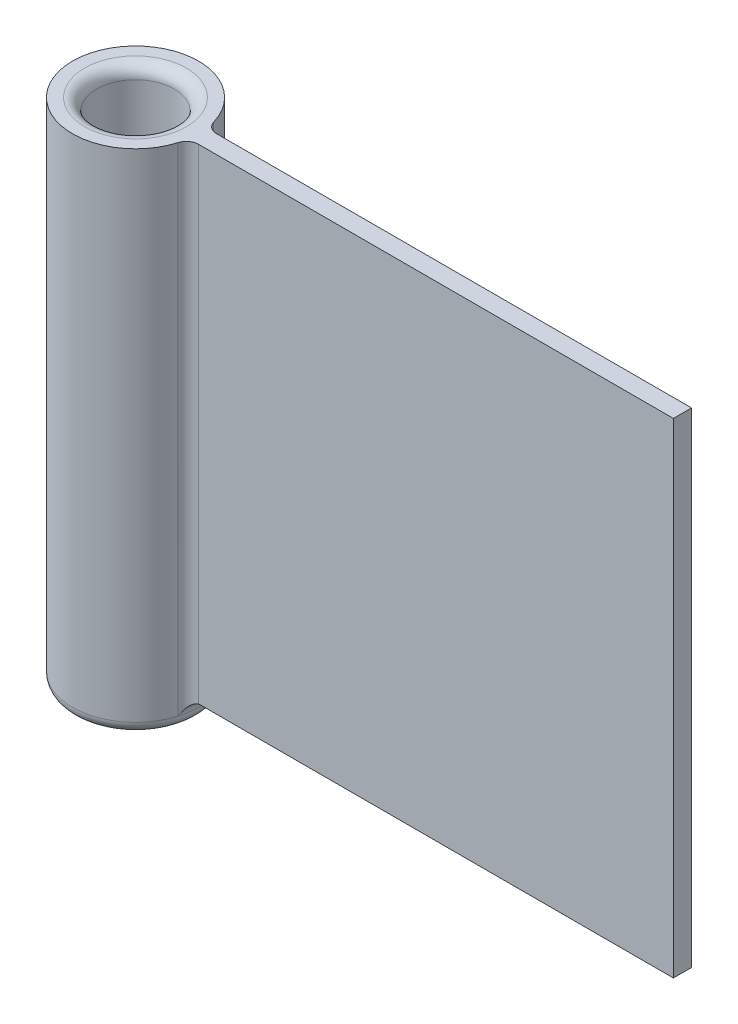
ISO-10303-21;
HEADER;
FILE_DESCRIPTION(('STEP AP214'),'2;1');
FILE_NAME('part.step','',(''),(''),'','','');
FILE_SCHEMA(('AUTOMOTIVE_DESIGN { 1 0 10303 214 1 1 1 1 }'));
ENDSEC;
DATA;
#1=APPLICATION_CONTEXT('core data for automotive mechanical design processes');
#2=APPLICATION_PROTOCOL_DEFINITION('international standard','automotive_design',2000,#1);
#3=PRODUCT_CONTEXT('',#1,'mechanical');
#4=PRODUCT('Part','Part','',(#3));
#5=PRODUCT_RELATED_PRODUCT_CATEGORY('part','',(#4));
#6=PRODUCT_DEFINITION_FORMATION('','',#4);
#7=PRODUCT_DEFINITION_CONTEXT('part definition',#1,'design');
#8=PRODUCT_DEFINITION('design','',#6,#7);
#9=PRODUCT_DEFINITION_SHAPE('','',#8);
#10=(LENGTH_UNIT() NAMED_UNIT(*) SI_UNIT(.MILLI.,.METRE.));
#11=(NAMED_UNIT(*) PLANE_ANGLE_UNIT() SI_UNIT($,.RADIAN.));
#12=(NAMED_UNIT(*) SI_UNIT($,.STERADIAN.) SOLID_ANGLE_UNIT());
#13=UNCERTAINTY_MEASURE_WITH_UNIT(LENGTH_MEASURE(1.E-05),#10,'distance_accuracy_value','');
#14=(GEOMETRIC_REPRESENTATION_CONTEXT(3) GLOBAL_UNCERTAINTY_ASSIGNED_CONTEXT((#13)) GLOBAL_UNIT_ASSIGNED_CONTEXT((#10,
#11,#12)) REPRESENTATION_CONTEXT('',''));
#15=CARTESIAN_POINT('',(0.,0.,0.));
#16=DIRECTION('',(0.,0.,1.));
#17=DIRECTION('',(1.,0.,0.));
#18=AXIS2_PLACEMENT_3D('',#15,#16,#17);
#19=CARTESIAN_POINT('',(0.,0.,0.));
#20=DIRECTION('',(0.,1.,0.));
#21=DIRECTION('',(0.,0.,1.));
#22=AXIS2_PLACEMENT_3D('',#19,#20,#21);
#23=PLANE('',#22);
#24=DIRECTION('',(1.,0.,0.));
#25=VECTOR('',#24,1.);
#26=CARTESIAN_POINT('',(45.1456292132255,0.,0.75));
#27=LINE('',#26,#25);
#28=CARTESIAN_POINT('',(6.15446992030996,0.,0.749999999999995));
#29=VERTEX_POINT('',#28);
#30=CARTESIAN_POINT('',(45.1456292132255,0.,0.75));
#31=VERTEX_POINT('',#30);
#32=EDGE_CURVE('E123',#29,#31,#27,.T.);
#33=ORIENTED_EDGE('',*,*,#32,.F.);
#34=CARTESIAN_POINT('',(0.,0.,0.));
#35=DIRECTION('',(0.,1.,0.));
#36=DIRECTION('',(0.,0.,1.));
#37=AXIS2_PLACEMENT_3D('',#34,#35,#36);
#38=CIRCLE('',#37,6.2);
#39=CARTESIAN_POINT('',(6.15446992030996,0.,-0.749999999999995));
#40=VERTEX_POINT('',#39);
#41=EDGE_CURVE('E180',#29,#40,#38,.T.);
#42=ORIENTED_EDGE('',*,*,#41,.T.);
#43=DIRECTION('',(-1.,0.,0.));
#44=VECTOR('',#43,1.);
#45=CARTESIAN_POINT('',(45.1456292132255,0.,-0.75));
#46=LINE('',#45,#44);
#47=CARTESIAN_POINT('',(45.1456292132255,0.,-0.75));
#48=VERTEX_POINT('',#47);
#49=EDGE_CURVE('E271',#48,#40,#46,.T.);
#50=ORIENTED_EDGE('',*,*,#49,.F.);
#51=DIRECTION('',(0.,0.,-1.));
#52=VECTOR('',#51,1.);
#53=CARTESIAN_POINT('',(45.1456292132255,0.,0.75));
#54=LINE('',#53,#52);
#55=EDGE_CURVE('E127',#31,#48,#54,.T.);
#56=ORIENTED_EDGE('',*,*,#55,.F.);
#57=EDGE_LOOP('',(#33,#42,#50,#56));
#58=FACE_BOUND('',#57,.T.);
#59=ADVANCED_FACE('F39',(#58),#23,.F.);
#60=CARTESIAN_POINT('',(0.,40.,0.));
#61=DIRECTION('',(0.,-1.,0.));
#62=DIRECTION('',(0.,0.,-1.));
#63=AXIS2_PLACEMENT_3D('',#60,#61,#62);
#64=CYLINDRICAL_SURFACE('',#63,5.2);
#65=CARTESIAN_POINT('',(0.,-1.,0.));
#66=DIRECTION('',(0.,-1.,0.));
#67=DIRECTION('',(0.,0.,-1.));
#68=AXIS2_PLACEMENT_3D('',#65,#66,#67);
#69=CIRCLE('',#68,5.2);
#70=CARTESIAN_POINT('',(4.98856027434991,-1.,-1.46774193548387));
#71=VERTEX_POINT('',#70);
#72=CARTESIAN_POINT('',(4.98856027434991,-1.,1.46774193548387));
#73=VERTEX_POINT('',#72);
#74=EDGE_CURVE('E160',#71,#73,#69,.F.);
#75=ORIENTED_EDGE('',*,*,#74,.T.);
#76=DIRECTION('',(0.,-1.,0.));
#77=VECTOR('',#76,1.);
#78=CARTESIAN_POINT('',(4.98856027434991,40.,1.46774193548387));
#79=LINE('',#78,#77);
#80=CARTESIAN_POINT('',(4.98856027434991,40.,1.46774193548387));
#81=VERTEX_POINT('',#80);
#82=EDGE_CURVE('E165',#73,#81,#79,.F.);
#83=ORIENTED_EDGE('',*,*,#82,.T.);
#84=CARTESIAN_POINT('',(0.,40.,0.));
#85=DIRECTION('',(0.,1.,0.));
#86=DIRECTION('',(0.,0.,1.));
#87=AXIS2_PLACEMENT_3D('',#84,#85,#86);
#88=CIRCLE('',#87,5.2);
#89=CARTESIAN_POINT('',(4.98856027434991,40.,-1.46774193548387));
#90=VERTEX_POINT('',#89);
#91=EDGE_CURVE('E129',#90,#81,#88,.T.);
#92=ORIENTED_EDGE('',*,*,#91,.F.);
#93=DIRECTION('',(0.,-1.,0.));
#94=VECTOR('',#93,1.);
#95=CARTESIAN_POINT('',(4.98856027434991,40.,-1.46774193548387));
#96=LINE('',#95,#94);
#97=EDGE_CURVE('E157',#90,#71,#96,.T.);
#98=ORIENTED_EDGE('',*,*,#97,.T.);
#99=EDGE_LOOP('',(#75,#83,#92,#98));
#100=FACE_BOUND('',#99,.T.);
#101=ADVANCED_FACE('F216',(#100),#64,.T.);
#102=CARTESIAN_POINT('',(0.,40.,0.));
#103=DIRECTION('',(0.,1.,0.));
#104=DIRECTION('',(0.,0.,1.));
#105=AXIS2_PLACEMENT_3D('',#102,#103,#104);
#106=PLANE('',#105);
#107=CARTESIAN_POINT('',(0.,40.,0.));
#108=DIRECTION('',(0.,1.,0.));
#109=DIRECTION('',(0.,0.,1.));
#110=AXIS2_PLACEMENT_3D('',#107,#108,#109);
#111=CIRCLE('',#110,4.2);
#112=CARTESIAN_POINT('',(0.,40.,4.2));
#113=VERTEX_POINT('',#112);
#114=EDGE_CURVE('E151',#113,#113,#111,.F.);
#115=ORIENTED_EDGE('',*,*,#114,.T.);
#116=EDGE_LOOP('',(#115));
#117=FACE_BOUND('',#116,.T.);
#118=DIRECTION('',(-1.,0.,0.));
#119=VECTOR('',#118,1.);
#120=CARTESIAN_POINT('',(45.1456292132255,40.,-0.75));
#121=LINE('',#120,#119);
#122=CARTESIAN_POINT('',(45.1456292132255,40.,-0.75));
#123=VERTEX_POINT('',#122);
#124=CARTESIAN_POINT('',(5.94789878864797,40.,-0.749999999999995));
#125=VERTEX_POINT('',#124);
#126=EDGE_CURVE('E105',#123,#125,#121,.T.);
#127=ORIENTED_EDGE('',*,*,#126,.T.);
#128=CARTESIAN_POINT('',(5.94789878864797,40.,-1.75));
#129=DIRECTION('',(0.,1.,0.));
#130=DIRECTION('',(0.,0.,1.));
#131=AXIS2_PLACEMENT_3D('',#128,#129,#130);
#132=CIRCLE('',#131,1.);
#133=EDGE_CURVE('E177',#125,#90,#132,.F.);
#134=ORIENTED_EDGE('',*,*,#133,.T.);
#135=ORIENTED_EDGE('',*,*,#91,.T.);
#136=CARTESIAN_POINT('',(5.94789878864797,40.,1.75));
#137=DIRECTION('',(0.,1.,0.));
#138=DIRECTION('',(0.,0.,1.));
#139=AXIS2_PLACEMENT_3D('',#136,#137,#138);
#140=CIRCLE('',#139,1.);
#141=CARTESIAN_POINT('',(5.94789878864797,40.,0.749999999999995));
#142=VERTEX_POINT('',#141);
#143=EDGE_CURVE('E174',#81,#142,#140,.F.);
#144=ORIENTED_EDGE('',*,*,#143,.T.);
#145=DIRECTION('',(1.,0.,0.));
#146=VECTOR('',#145,1.);
#147=CARTESIAN_POINT('',(45.1456292132255,40.,0.75));
#148=LINE('',#147,#146);
#149=CARTESIAN_POINT('',(45.1456292132255,40.,0.75));
#150=VERTEX_POINT('',#149);
#151=EDGE_CURVE('E114',#142,#150,#148,.T.);
#152=ORIENTED_EDGE('',*,*,#151,.T.);
#153=DIRECTION('',(0.,0.,-1.));
#154=VECTOR('',#153,1.);
#155=CARTESIAN_POINT('',(45.1456292132255,40.,0.75));
#156=LINE('',#155,#154);
#157=EDGE_CURVE('E115',#150,#123,#156,.T.);
#158=ORIENTED_EDGE('',*,*,#157,.T.);
#159=EDGE_LOOP('',(#127,#134,#135,#144,#152,#158));
#160=FACE_BOUND('',#159,.T.);
#161=ADVANCED_FACE('F118',(#117,#160),#106,.T.);
#162=CARTESIAN_POINT('',(0.,40.,0.));
#163=DIRECTION('',(0.,-1.,0.));
#164=DIRECTION('',(0.,0.,-1.));
#165=AXIS2_PLACEMENT_3D('',#162,#163,#164);
#166=CYLINDRICAL_SURFACE('',#165,3.2);
#167=CARTESIAN_POINT('',(0.,1.,0.));
#168=DIRECTION('',(0.,-1.,0.));
#169=DIRECTION('',(0.,0.,-1.));
#170=AXIS2_PLACEMENT_3D('',#167,#168,#169);
#171=CIRCLE('',#170,3.2);
#172=CARTESIAN_POINT('',(0.,1.,-3.2));
#173=VERTEX_POINT('',#172);
#174=EDGE_CURVE('E147',#173,#173,#171,.T.);
#175=ORIENTED_EDGE('',*,*,#174,.T.);
#176=EDGE_LOOP('',(#175));
#177=FACE_BOUND('',#176,.T.);
#178=CARTESIAN_POINT('',(0.,39.,0.));
#179=DIRECTION('',(0.,1.,0.));
#180=DIRECTION('',(0.,0.,1.));
#181=AXIS2_PLACEMENT_3D('',#178,#179,#180);
#182=CIRCLE('',#181,3.2);
#183=CARTESIAN_POINT('',(0.,39.,3.2));
#184=VERTEX_POINT('',#183);
#185=EDGE_CURVE('E143',#184,#184,#182,.T.);
#186=ORIENTED_EDGE('',*,*,#185,.T.);
#187=EDGE_LOOP('',(#186));
#188=FACE_BOUND('',#187,.T.);
#189=ADVANCED_FACE('F243',(#177,#188),#166,.F.);
#190=CARTESIAN_POINT('',(45.1456292132255,40.,0.75));
#191=DIRECTION('',(-1.,0.,0.));
#192=DIRECTION('',(0.,0.,1.));
#193=AXIS2_PLACEMENT_3D('',#190,#191,#192);
#194=PLANE('',#193);
#195=ORIENTED_EDGE('',*,*,#55,.T.);
#196=DIRECTION('',(0.,-1.,0.));
#197=VECTOR('',#196,1.);
#198=CARTESIAN_POINT('',(45.1456292132255,40.,-0.75));
#199=LINE('',#198,#197);
#200=EDGE_CURVE('E110',#123,#48,#199,.T.);
#201=ORIENTED_EDGE('',*,*,#200,.F.);
#202=ORIENTED_EDGE('',*,*,#157,.F.);
#203=DIRECTION('',(0.,-1.,0.));
#204=VECTOR('',#203,1.);
#205=CARTESIAN_POINT('',(45.1456292132255,40.,0.75));
#206=LINE('',#205,#204);
#207=EDGE_CURVE('E130',#150,#31,#206,.T.);
#208=ORIENTED_EDGE('',*,*,#207,.T.);
#209=EDGE_LOOP('',(#195,#201,#202,#208));
#210=FACE_BOUND('',#209,.T.);
#211=ADVANCED_FACE('F125',(#210),#194,.F.);
#212=CARTESIAN_POINT('',(45.1456292132255,40.,-0.75));
#213=DIRECTION('',(0.,0.,1.));
#214=DIRECTION('',(1.,0.,0.));
#215=AXIS2_PLACEMENT_3D('',#212,#213,#214);
#216=PLANE('',#215);
#217=ORIENTED_EDGE('',*,*,#49,.T.);
#218=CARTESIAN_POINT('',(6.15446992030995,0.,-0.749999999999995));
#219=CARTESIAN_POINT('',(6.11967844426265,-9.78500983339099E-06,-0.749999999999995));
#220=CARTESIAN_POINT('',(6.08506843363106,-0.00178455189712006,-0.749999999999995));
#221=CARTESIAN_POINT('',(6.01621139023961,-0.00886404459018018,-0.749999999999995));
#222=CARTESIAN_POINT('',(5.98196435698388,-0.0141687655729066,-0.749999999999995));
#223=CARTESIAN_POINT('',(5.94789878864797,-0.0212384636100392,-0.749999999999995));
#224=B_SPLINE_CURVE_WITH_KNOTS('',3,(#218,#219,#220,#221,#222,#223),.UNSPECIFIED.,.F.,.F.,(4,2,
4),(0.,0.103966454689998,0.207932767328836),.UNSPECIFIED.);
#225=CARTESIAN_POINT('',(5.94789878864797,-0.0212384636100391,-0.749999999999995));
#226=VERTEX_POINT('',#225);
#227=EDGE_CURVE('E53',#40,#226,#224,.T.);
#228=ORIENTED_EDGE('',*,*,#227,.T.);
#229=DIRECTION('',(0.,1.,0.));
#230=VECTOR('',#229,1.);
#231=CARTESIAN_POINT('',(5.94789878864797,40.,-0.749999999999995));
#232=LINE('',#231,#230);
#233=EDGE_CURVE('E59',#226,#125,#232,.T.);
#234=ORIENTED_EDGE('',*,*,#233,.T.);
#235=ORIENTED_EDGE('',*,*,#126,.F.);
#236=ORIENTED_EDGE('',*,*,#200,.T.);
#237=EDGE_LOOP('',(#217,#228,#234,#235,#236));
#238=FACE_BOUND('',#237,.T.);
#239=ADVANCED_FACE('F108',(#238),#216,.F.);
#240=CARTESIAN_POINT('',(45.1456292132255,40.,0.75));
#241=DIRECTION('',(0.,0.,-1.));
#242=DIRECTION('',(-1.,0.,0.));
#243=AXIS2_PLACEMENT_3D('',#240,#241,#242);
#244=PLANE('',#243);
#245=ORIENTED_EDGE('',*,*,#151,.F.);
#246=DIRECTION('',(0.,1.,0.));
#247=VECTOR('',#246,1.);
#248=CARTESIAN_POINT('',(5.94789878864797,0.,0.749999999999995));
#249=LINE('',#248,#247);
#250=CARTESIAN_POINT('',(5.94789878864797,-0.021238463610039,0.749999999999995));
#251=VERTEX_POINT('',#250);
#252=EDGE_CURVE('E67',#142,#251,#249,.F.);
#253=ORIENTED_EDGE('',*,*,#252,.T.);
#254=CARTESIAN_POINT('',(5.94789878864797,-0.021238463610039,0.749999999999995));
#255=CARTESIAN_POINT('',(5.98196435698388,-0.0141687655729062,0.749999999999995));
#256=CARTESIAN_POINT('',(6.01621139023961,-0.00886404459017985,0.749999999999995));
#257=CARTESIAN_POINT('',(6.08506843363106,-0.00178455189712011,0.749999999999995));
#258=CARTESIAN_POINT('',(6.11967844426265,-9.78500983376148E-06,0.749999999999995));
#259=CARTESIAN_POINT('',(6.15446992030995,0.,0.749999999999995));
#260=B_SPLINE_CURVE_WITH_KNOTS('',3,(#254,#255,#256,#257,#258,#259),.UNSPECIFIED.,.F.,.F.,(4,2,
4),(0.,0.103966312638838,0.207932767328835),.UNSPECIFIED.);
#261=EDGE_CURVE('E191',#251,#29,#260,.T.);
#262=ORIENTED_EDGE('',*,*,#261,.T.);
#263=ORIENTED_EDGE('',*,*,#32,.T.);
#264=ORIENTED_EDGE('',*,*,#207,.F.);
#265=EDGE_LOOP('',(#245,#253,#262,#263,#264));
#266=FACE_BOUND('',#265,.T.);
#267=ADVANCED_FACE('F257',(#266),#244,.F.);
#268=CARTESIAN_POINT('',(0.,-2.,0.));
#269=DIRECTION('',(0.,-1.,0.));
#270=DIRECTION('',(0.,0.,-1.));
#271=AXIS2_PLACEMENT_3D('',#268,#269,#270);
#272=PLANE('',#271);
#273=CARTESIAN_POINT('',(0.,-2.,0.));
#274=DIRECTION('',(0.,-1.,0.));
#275=DIRECTION('',(0.,0.,-1.));
#276=AXIS2_PLACEMENT_3D('',#273,#274,#275);
#277=CIRCLE('',#276,4.2);
#278=CARTESIAN_POINT('',(0.,-2.,-4.2));
#279=VERTEX_POINT('',#278);
#280=EDGE_CURVE('E168',#279,#279,#277,.T.);
#281=ORIENTED_EDGE('',*,*,#280,.T.);
#282=EDGE_LOOP('',(#281));
#283=FACE_BOUND('',#282,.T.);
#284=ADVANCED_FACE('F236',(#283),#272,.T.);
#285=CARTESIAN_POINT('',(0.,0.,0.));
#286=DIRECTION('',(0.,-1.,0.));
#287=DIRECTION('',(0.,0.,-1.));
#288=AXIS2_PLACEMENT_3D('',#285,#286,#287);
#289=PLANE('',#288);
#290=CARTESIAN_POINT('',(0.,0.,0.));
#291=DIRECTION('',(0.,-1.,0.));
#292=DIRECTION('',(0.,0.,-1.));
#293=AXIS2_PLACEMENT_3D('',#290,#291,#292);
#294=CIRCLE('',#293,2.2);
#295=CARTESIAN_POINT('',(0.,0.,-2.2));
#296=VERTEX_POINT('',#295);
#297=EDGE_CURVE('E135',#296,#296,#294,.F.);
#298=ORIENTED_EDGE('',*,*,#297,.T.);
#299=EDGE_LOOP('',(#298));
#300=FACE_BOUND('',#299,.T.);
#301=ADVANCED_FACE('F229',(#300),#289,.F.);
#302=CARTESIAN_POINT('',(0.,1.,0.));
#303=DIRECTION('',(0.,-1.,0.));
#304=DIRECTION('',(0.,0.,-1.));
#305=AXIS2_PLACEMENT_3D('',#302,#303,#304);
#306=TOROIDAL_SURFACE('',#305,2.2,1.);
#307=ORIENTED_EDGE('',*,*,#174,.F.);
#308=EDGE_LOOP('',(#307));
#309=FACE_BOUND('',#308,.T.);
#310=ORIENTED_EDGE('',*,*,#297,.F.);
#311=EDGE_LOOP('',(#310));
#312=FACE_BOUND('',#311,.T.);
#313=ADVANCED_FACE('F227',(#309,#312),#306,.F.);
#314=CARTESIAN_POINT('',(0.,39.,0.));
#315=DIRECTION('',(0.,1.,0.));
#316=DIRECTION('',(0.,0.,1.));
#317=AXIS2_PLACEMENT_3D('',#314,#315,#316);
#318=TOROIDAL_SURFACE('',#317,4.2,1.);
#319=ORIENTED_EDGE('',*,*,#114,.F.);
#320=EDGE_LOOP('',(#319));
#321=FACE_BOUND('',#320,.T.);
#322=ORIENTED_EDGE('',*,*,#185,.F.);
#323=EDGE_LOOP('',(#322));
#324=FACE_BOUND('',#323,.T.);
#325=ADVANCED_FACE('F203',(#321,#324),#318,.T.);
#326=CARTESIAN_POINT('',(5.94789878864797,40.,1.75));
#327=DIRECTION('',(0.,-1.,0.));
#328=DIRECTION('',(0.,0.,-1.));
#329=AXIS2_PLACEMENT_3D('',#326,#327,#328);
#330=CYLINDRICAL_SURFACE('',#329,1.);
#331=ORIENTED_EDGE('',*,*,#143,.F.);
#332=ORIENTED_EDGE('',*,*,#82,.F.);
#333=CARTESIAN_POINT('',(5.94789878864797,-0.021238463610039,0.749999999999995));
#334=CARTESIAN_POINT('',(5.92290959640482,-0.0264273066395352,0.749996680663713));
#335=CARTESIAN_POINT('',(5.89813758451402,-0.0325377487963944,0.750936940564361));
#336=CARTESIAN_POINT('',(5.84924785328517,-0.0464553302973333,0.754577200136941));
#337=CARTESIAN_POINT('',(5.82512915005095,-0.0542597379566363,0.757274380455691));
#338=CARTESIAN_POINT('',(5.75451453442134,-0.0798246733988814,0.767733841296383));
#339=CARTESIAN_POINT('',(5.70917153411727,-0.0998641991676301,0.777870242061993));
#340=CARTESIAN_POINT('',(5.62287113809302,-0.144608513794417,0.803228930944167));
#341=CARTESIAN_POINT('',(5.58188875602735,-0.169284199576801,0.818419924826133));
#342=CARTESIAN_POINT('',(5.50409645410241,-0.222335480567345,0.852863599708221));
#343=CARTESIAN_POINT('',(5.46730076481928,-0.250723028820877,0.872129532355801));
#344=CARTESIAN_POINT('',(5.37514454913894,-0.329812383579267,0.927527928039495));
#345=CARTESIAN_POINT('',(5.32349699426862,-0.382907482613652,0.966417844553947));
#346=CARTESIAN_POINT('',(5.23096273875001,-0.493625477770507,1.0500684821257));
#347=CARTESIAN_POINT('',(5.19010001042861,-0.551258097008413,1.0948419558684));
#348=CARTESIAN_POINT('',(5.11611241149742,-0.672581465232241,1.19139074376639));
#349=CARTESIAN_POINT('',(5.08358797354849,-0.736428925871041,1.24342353575006));
#350=CARTESIAN_POINT('',(5.02895094694299,-0.865315174958302,1.35104424856681));
#351=CARTESIAN_POINT('',(5.00681634751989,-0.930351138902606,1.40662436786041));
#352=CARTESIAN_POINT('',(4.98936696917623,-0.996890594140511,1.46501095799657));
#353=CARTESIAN_POINT('',(4.98896216458625,-0.998445316621415,1.46637603661256));
#354=CARTESIAN_POINT('',(4.98856027434991,-1.,1.46774193548387));
#355=B_SPLINE_CURVE_WITH_KNOTS('',3,(#333,#334,#335,#336,#337,#338,#339,#340,#341,#342,#343,
#344,#345,#346,#347,#348,#349,#350,#351,#352,#353,#354),.UNSPECIFIED.,.F.,.F.,(4,2,2,2,2,2,2,2,
2,2,4),(0.,0.0764893301384535,0.152856218227784,0.303813321884984,0.453852683632135,
0.604387686967971,0.853961741562552,1.10408596003756,1.36900047030483,1.63335120034943,
1.63967576224939),.UNSPECIFIED.);
#356=EDGE_CURVE('E183',#73,#251,#355,.F.);
#357=ORIENTED_EDGE('',*,*,#356,.T.);
#358=ORIENTED_EDGE('',*,*,#252,.F.);
#359=EDGE_LOOP('',(#331,#332,#357,#358));
#360=FACE_BOUND('',#359,.T.);
#361=ADVANCED_FACE('F197',(#360),#330,.F.);
#362=CARTESIAN_POINT('',(0.,-1.,0.));
#363=DIRECTION('',(0.,-1.,0.));
#364=DIRECTION('',(0.,0.,-1.));
#365=AXIS2_PLACEMENT_3D('',#362,#363,#364);
#366=TOROIDAL_SURFACE('',#365,4.2,1.);
#367=EDGE_CURVE('E161',#73,#71,#69,.F.);
#368=ORIENTED_EDGE('',*,*,#367,.F.);
#369=ORIENTED_EDGE('',*,*,#74,.F.);
#370=EDGE_LOOP('',(#368,#369));
#371=FACE_BOUND('',#370,.T.);
#372=ORIENTED_EDGE('',*,*,#280,.F.);
#373=EDGE_LOOP('',(#372));
#374=FACE_BOUND('',#373,.T.);
#375=ADVANCED_FACE('F202',(#371,#374),#366,.T.);
#376=CARTESIAN_POINT('',(5.94789878864797,40.,-1.75));
#377=DIRECTION('',(0.,-1.,0.));
#378=DIRECTION('',(0.,0.,-1.));
#379=AXIS2_PLACEMENT_3D('',#376,#377,#378);
#380=CYLINDRICAL_SURFACE('',#379,1.);
#381=ORIENTED_EDGE('',*,*,#133,.F.);
#382=ORIENTED_EDGE('',*,*,#233,.F.);
#383=CARTESIAN_POINT('',(5.94789878864797,-0.021238463610039,-0.749999999999995));
#384=CARTESIAN_POINT('',(5.92290959640482,-0.0264273066395352,-0.749996680663713));
#385=CARTESIAN_POINT('',(5.89813758451402,-0.0325377487963944,-0.750936940564361));
#386=CARTESIAN_POINT('',(5.84924785328517,-0.0464553302973333,-0.754577200136941));
#387=CARTESIAN_POINT('',(5.82512915005095,-0.0542597379566363,-0.757274380455691));
#388=CARTESIAN_POINT('',(5.75451453442134,-0.0798246733988814,-0.767733841296383));
#389=CARTESIAN_POINT('',(5.70917153411727,-0.0998641991676301,-0.777870242061993));
#390=CARTESIAN_POINT('',(5.62287113809302,-0.144608513794417,-0.803228930944167));
#391=CARTESIAN_POINT('',(5.58188875602735,-0.169284199576801,-0.818419924826133));
#392=CARTESIAN_POINT('',(5.50409645410241,-0.222335480567345,-0.852863599708221));
#393=CARTESIAN_POINT('',(5.46730076481928,-0.250723028820877,-0.872129532355801));
#394=CARTESIAN_POINT('',(5.37514454913894,-0.329812383579267,-0.927527928039495));
#395=CARTESIAN_POINT('',(5.32349699426862,-0.382907482613652,-0.966417844553947));
#396=CARTESIAN_POINT('',(5.23096273875001,-0.493625477770507,-1.0500684821257));
#397=CARTESIAN_POINT('',(5.19010001042861,-0.551258097008413,-1.0948419558684));
#398=CARTESIAN_POINT('',(5.11611241149742,-0.672581465232241,-1.19139074376639));
#399=CARTESIAN_POINT('',(5.08358797354849,-0.736428925871041,-1.24342353575006));
#400=CARTESIAN_POINT('',(5.02895094694299,-0.865315174958302,-1.35104424856681));
#401=CARTESIAN_POINT('',(5.00681634751989,-0.930351138902606,-1.40662436786041));
#402=CARTESIAN_POINT('',(4.98936696917623,-0.996890594140511,-1.46501095799657));
#403=CARTESIAN_POINT('',(4.98896216458625,-0.998445316621415,-1.46637603661256));
#404=CARTESIAN_POINT('',(4.98856027434991,-1.,-1.46774193548387));
#405=B_SPLINE_CURVE_WITH_KNOTS('',3,(#383,#384,#385,#386,#387,#388,#389,#390,#391,#392,#393,
#394,#395,#396,#397,#398,#399,#400,#401,#402,#403,#404),.UNSPECIFIED.,.F.,.F.,(4,2,2,2,2,2,2,2,
2,2,4),(0.,0.0764893301384535,0.152856218227784,0.303813321884984,0.453852683632135,
0.604387686967971,0.853961741562552,1.10408596003756,1.36900047030483,1.63335120034943,
1.63967576224939),.UNSPECIFIED.);
#406=EDGE_CURVE('E11',#226,#71,#405,.T.);
#407=ORIENTED_EDGE('',*,*,#406,.T.);
#408=ORIENTED_EDGE('',*,*,#97,.F.);
#409=EDGE_LOOP('',(#381,#382,#407,#408));
#410=FACE_BOUND('',#409,.T.);
#411=ADVANCED_FACE('F207',(#410),#380,.F.);
#412=CARTESIAN_POINT('',(0.,-1.,0.));
#413=DIRECTION('',(0.,1.,0.));
#414=DIRECTION('',(0.,0.,1.));
#415=AXIS2_PLACEMENT_3D('',#412,#413,#414);
#416=TOROIDAL_SURFACE('',#415,6.2,1.);
#417=ORIENTED_EDGE('',*,*,#227,.F.);
#418=ORIENTED_EDGE('',*,*,#41,.F.);
#419=ORIENTED_EDGE('',*,*,#261,.F.);
#420=ORIENTED_EDGE('',*,*,#356,.F.);
#421=ORIENTED_EDGE('',*,*,#367,.T.);
#422=ORIENTED_EDGE('',*,*,#406,.F.);
#423=EDGE_LOOP('',(#417,#418,#419,#420,#421,#422));
#424=FACE_BOUND('',#423,.T.);
#425=ADVANCED_FACE('F41',(#424),#416,.F.);
#426=CLOSED_SHELL('',(#59,#101,#161,#189,#211,#239,#267,#284,#301,#313,#325,#361,#375,#411,#425));
#427=MANIFOLD_SOLID_BREP('B2',#426);
#428=ADVANCED_BREP_SHAPE_REPRESENTATION('',(#18,#427),#14);
#429=SHAPE_DEFINITION_REPRESENTATION(#9,#428);
ENDSEC;
END-ISO-10303-21;
